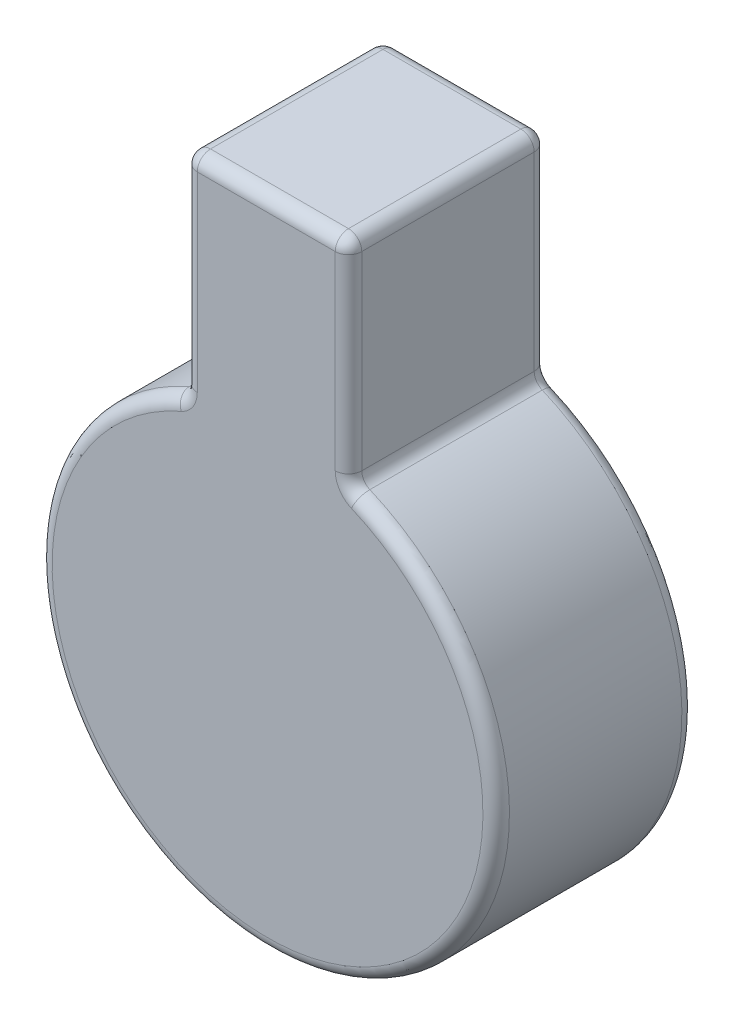
ISO-10303-21;
HEADER;
FILE_DESCRIPTION(('STEP AP214'),'2;1');
FILE_NAME('part.step','',(''),(''),'','','');
FILE_SCHEMA(('AUTOMOTIVE_DESIGN { 1 0 10303 214 1 1 1 1 }'));
ENDSEC;
DATA;
#1=APPLICATION_CONTEXT('core data for automotive mechanical design processes');
#2=APPLICATION_PROTOCOL_DEFINITION('international standard','automotive_design',2000,#1);
#3=PRODUCT_CONTEXT('',#1,'mechanical');
#4=PRODUCT('Part','Part','',(#3));
#5=PRODUCT_RELATED_PRODUCT_CATEGORY('part','',(#4));
#6=PRODUCT_DEFINITION_FORMATION('','',#4);
#7=PRODUCT_DEFINITION_CONTEXT('part definition',#1,'design');
#8=PRODUCT_DEFINITION('design','',#6,#7);
#9=PRODUCT_DEFINITION_SHAPE('','',#8);
#10=(LENGTH_UNIT() NAMED_UNIT(*) SI_UNIT(.MILLI.,.METRE.));
#11=(NAMED_UNIT(*) PLANE_ANGLE_UNIT() SI_UNIT($,.RADIAN.));
#12=(NAMED_UNIT(*) SI_UNIT($,.STERADIAN.) SOLID_ANGLE_UNIT());
#13=UNCERTAINTY_MEASURE_WITH_UNIT(LENGTH_MEASURE(1.E-05),#10,'distance_accuracy_value','');
#14=(GEOMETRIC_REPRESENTATION_CONTEXT(3) GLOBAL_UNCERTAINTY_ASSIGNED_CONTEXT((#13)) GLOBAL_UNIT_ASSIGNED_CONTEXT((#10,
#11,#12)) REPRESENTATION_CONTEXT('',''));
#15=CARTESIAN_POINT('',(0.,0.,0.));
#16=DIRECTION('',(0.,0.,1.));
#17=DIRECTION('',(1.,0.,0.));
#18=AXIS2_PLACEMENT_3D('',#15,#16,#17);
#19=CARTESIAN_POINT('',(0.,0.,38.1));
#20=DIRECTION('',(0.,0.,-1.));
#21=DIRECTION('',(-1.,0.,0.));
#22=AXIS2_PLACEMENT_3D('',#19,#20,#21);
#23=CYLINDRICAL_SURFACE('',#22,43.792404988183);
#24=CARTESIAN_POINT('',(0.,0.,2.54));
#25=DIRECTION('',(0.,0.,1.));
#26=DIRECTION('',(1.,0.,0.));
#27=AXIS2_PLACEMENT_3D('',#24,#25,#26);
#28=CIRCLE('',#27,43.792404988183);
#29=CARTESIAN_POINT('',(-17.5225403342247,40.1339670962702,2.54));
#30=VERTEX_POINT('',#29);
#31=CARTESIAN_POINT('',(17.0563701275492,40.3342902840881,2.54));
#32=VERTEX_POINT('',#31);
#33=EDGE_CURVE('E562',#30,#32,#28,.T.);
#34=ORIENTED_EDGE('',*,*,#33,.T.);
#35=DIRECTION('',(0.,0.,-1.));
#36=VECTOR('',#35,1.);
#37=CARTESIAN_POINT('',(17.0563701275492,40.3342902840881,38.1));
#38=LINE('',#37,#36);
#39=CARTESIAN_POINT('',(17.0563701275492,40.3342902840881,35.56));
#40=VERTEX_POINT('',#39);
#41=EDGE_CURVE('E190',#32,#40,#38,.F.);
#42=ORIENTED_EDGE('',*,*,#41,.T.);
#43=CARTESIAN_POINT('',(0.,0.,35.56));
#44=DIRECTION('',(0.,0.,1.));
#45=DIRECTION('',(1.,0.,0.));
#46=AXIS2_PLACEMENT_3D('',#43,#44,#45);
#47=CIRCLE('',#46,43.792404988183);
#48=CARTESIAN_POINT('',(-17.5225403342247,40.1339670962702,35.56));
#49=VERTEX_POINT('',#48);
#50=EDGE_CURVE('E156',#40,#49,#47,.F.);
#51=ORIENTED_EDGE('',*,*,#50,.T.);
#52=DIRECTION('',(0.,0.,-1.));
#53=VECTOR('',#52,1.);
#54=CARTESIAN_POINT('',(-17.5225403342247,40.1339670962702,38.1));
#55=LINE('',#54,#53);
#56=EDGE_CURVE('E188',#49,#30,#55,.T.);
#57=ORIENTED_EDGE('',*,*,#56,.T.);
#58=EDGE_LOOP('',(#34,#42,#51,#57));
#59=FACE_BOUND('',#58,.T.);
#60=ADVANCED_FACE('F34',(#59),#23,.T.);
#61=CARTESIAN_POINT('',(0.,0.,38.1));
#62=DIRECTION('',(0.,0.,1.));
#63=DIRECTION('',(1.,0.,0.));
#64=AXIS2_PLACEMENT_3D('',#61,#62,#63);
#65=PLANE('',#64);
#66=CARTESIAN_POINT('',(0.,0.,38.1));
#67=DIRECTION('',(0.,0.,1.));
#68=DIRECTION('',(1.,0.,0.));
#69=AXIS2_PLACEMENT_3D('',#66,#67,#68);
#70=CIRCLE('',#69,41.252404988183);
#71=CARTESIAN_POINT('',(-16.5062167854052,37.8061598782827,38.1));
#72=VERTEX_POINT('',#71);
#73=CARTESIAN_POINT('',(16.0670848819531,37.9948641358957,38.1));
#74=VERTEX_POINT('',#73);
#75=EDGE_CURVE('E51',#72,#74,#70,.T.);
#76=ORIENTED_EDGE('',*,*,#75,.T.);
#77=CARTESIAN_POINT('',(18.0456553731452,42.6737164322804,38.1));
#78=DIRECTION('',(0.,0.,1.));
#79=DIRECTION('',(1.,0.,0.));
#80=AXIS2_PLACEMENT_3D('',#77,#78,#79);
#81=CIRCLE('',#80,5.08);
#82=CARTESIAN_POINT('',(12.9656553731452,42.6737164322804,38.1));
#83=VERTEX_POINT('',#82);
#84=EDGE_CURVE('E43',#83,#74,#81,.T.);
#85=ORIENTED_EDGE('',*,*,#84,.F.);
#86=DIRECTION('',(0.,1.,0.));
#87=VECTOR('',#86,1.);
#88=CARTESIAN_POINT('',(12.9656553731452,0.,38.1));
#89=LINE('',#88,#87);
#90=CARTESIAN_POINT('',(12.9656553731452,79.0386409401533,38.1));
#91=VERTEX_POINT('',#90);
#92=EDGE_CURVE('E259',#83,#91,#89,.T.);
#93=ORIENTED_EDGE('',*,*,#92,.T.);
#94=DIRECTION('',(-1.,0.,0.));
#95=VECTOR('',#94,1.);
#96=CARTESIAN_POINT('',(0.,79.0386409401533,38.1));
#97=LINE('',#96,#95);
#98=CARTESIAN_POINT('',(-13.4588638830442,79.0386409401533,38.1));
#99=VERTEX_POINT('',#98);
#100=EDGE_CURVE('E175',#91,#99,#97,.T.);
#101=ORIENTED_EDGE('',*,*,#100,.T.);
#102=DIRECTION('',(0.,-1.,0.));
#103=VECTOR('',#102,1.);
#104=CARTESIAN_POINT('',(-13.4588638830442,0.,38.1));
#105=LINE('',#104,#103);
#106=CARTESIAN_POINT('',(-13.4588638830442,42.4617743142578,38.1));
#107=VERTEX_POINT('',#106);
#108=EDGE_CURVE('E177',#99,#107,#105,.T.);
#109=ORIENTED_EDGE('',*,*,#108,.T.);
#110=CARTESIAN_POINT('',(-18.5388638830442,42.4617743142578,38.1));
#111=DIRECTION('',(0.,0.,1.));
#112=DIRECTION('',(1.,0.,0.));
#113=AXIS2_PLACEMENT_3D('',#110,#111,#112);
#114=CIRCLE('',#113,5.08);
#115=EDGE_CURVE('E146',#107,#72,#114,.F.);
#116=ORIENTED_EDGE('',*,*,#115,.T.);
#117=EDGE_LOOP('',(#76,#85,#93,#101,#109,#116));
#118=FACE_BOUND('',#117,.T.);
#119=ADVANCED_FACE('F334',(#118),#65,.T.);
#120=CARTESIAN_POINT('',(0.,0.,0.));
#121=DIRECTION('',(0.,0.,1.));
#122=DIRECTION('',(1.,0.,0.));
#123=AXIS2_PLACEMENT_3D('',#120,#121,#122);
#124=PLANE('',#123);
#125=DIRECTION('',(0.,1.,0.));
#126=VECTOR('',#125,1.);
#127=CARTESIAN_POINT('',(12.9656553731452,38.2274190700643,0.));
#128=LINE('',#127,#126);
#129=CARTESIAN_POINT('',(12.9656553731452,79.0386409401533,0.));
#130=VERTEX_POINT('',#129);
#131=CARTESIAN_POINT('',(12.9656553731452,42.6737164322804,0.));
#132=VERTEX_POINT('',#131);
#133=EDGE_CURVE('E140',#130,#132,#128,.F.);
#134=ORIENTED_EDGE('',*,*,#133,.T.);
#135=CARTESIAN_POINT('',(18.0456553731452,42.6737164322804,0.));
#136=DIRECTION('',(0.,0.,1.));
#137=DIRECTION('',(1.,0.,0.));
#138=AXIS2_PLACEMENT_3D('',#135,#136,#137);
#139=CIRCLE('',#138,5.08);
#140=CARTESIAN_POINT('',(16.0670848819531,37.9948641358957,0.));
#141=VERTEX_POINT('',#140);
#142=EDGE_CURVE('E134',#132,#141,#139,.T.);
#143=ORIENTED_EDGE('',*,*,#142,.T.);
#144=CARTESIAN_POINT('',(0.,0.,0.));
#145=DIRECTION('',(0.,0.,1.));
#146=DIRECTION('',(1.,0.,0.));
#147=AXIS2_PLACEMENT_3D('',#144,#145,#146);
#148=CIRCLE('',#147,41.252404988183);
#149=CARTESIAN_POINT('',(-16.5062167854052,37.8061598782827,0.));
#150=VERTEX_POINT('',#149);
#151=EDGE_CURVE('E137',#141,#150,#148,.F.);
#152=ORIENTED_EDGE('',*,*,#151,.T.);
#153=CARTESIAN_POINT('',(-18.5388638830442,42.4617743142578,0.));
#154=DIRECTION('',(0.,0.,1.));
#155=DIRECTION('',(1.,0.,0.));
#156=AXIS2_PLACEMENT_3D('',#153,#154,#155);
#157=CIRCLE('',#156,5.08);
#158=CARTESIAN_POINT('',(-13.4588638830442,42.4617743142578,0.));
#159=VERTEX_POINT('',#158);
#160=EDGE_CURVE('E208',#150,#159,#157,.T.);
#161=ORIENTED_EDGE('',*,*,#160,.T.);
#162=DIRECTION('',(0.,-1.,0.));
#163=VECTOR('',#162,1.);
#164=CARTESIAN_POINT('',(-13.4588638830442,81.5786409401533,0.));
#165=LINE('',#164,#163);
#166=CARTESIAN_POINT('',(-13.4588638830442,79.0386409401533,0.));
#167=VERTEX_POINT('',#166);
#168=EDGE_CURVE('E206',#159,#167,#165,.F.);
#169=ORIENTED_EDGE('',*,*,#168,.T.);
#170=DIRECTION('',(-1.,0.,0.));
#171=VECTOR('',#170,1.);
#172=CARTESIAN_POINT('',(15.5056553731452,79.0386409401533,0.));
#173=LINE('',#172,#171);
#174=EDGE_CURVE('E204',#167,#130,#173,.F.);
#175=ORIENTED_EDGE('',*,*,#174,.T.);
#176=EDGE_LOOP('',(#134,#143,#152,#161,#169,#175));
#177=FACE_BOUND('',#176,.T.);
#178=ADVANCED_FACE('F136',(#177),#124,.F.);
#179=CARTESIAN_POINT('',(0.,0.,35.56));
#180=DIRECTION('',(0.,0.,1.));
#181=DIRECTION('',(1.,0.,0.));
#182=AXIS2_PLACEMENT_3D('',#179,#180,#181);
#183=TOROIDAL_SURFACE('',#182,41.252404988183,2.54);
#184=CARTESIAN_POINT('',(-16.5062167854052,37.8061598782827,35.56));
#185=DIRECTION('',(-0.916459534640768,-0.400127381424998,0.));
#186=DIRECTION('',(0.400127381424998,-0.916459534640768,0.));
#187=AXIS2_PLACEMENT_3D('',#184,#185,#186);
#188=CIRCLE('',#187,2.54);
#189=EDGE_CURVE('E172',#72,#49,#188,.T.);
#190=ORIENTED_EDGE('',*,*,#189,.T.);
#191=ORIENTED_EDGE('',*,*,#50,.F.);
#192=CARTESIAN_POINT('',(16.0670848819531,37.9948641358957,35.56));
#193=DIRECTION('',(-0.921033916611156,0.389482380155912,0.));
#194=DIRECTION('',(-0.389482380155912,-0.921033916611156,0.));
#195=AXIS2_PLACEMENT_3D('',#192,#193,#194);
#196=CIRCLE('',#195,2.54);
#197=EDGE_CURVE('E264',#74,#40,#196,.T.);
#198=ORIENTED_EDGE('',*,*,#197,.F.);
#199=ORIENTED_EDGE('',*,*,#75,.F.);
#200=EDGE_LOOP('',(#190,#191,#198,#199));
#201=FACE_BOUND('',#200,.T.);
#202=ADVANCED_FACE('F345',(#201),#183,.T.);
#203=CARTESIAN_POINT('',(0.,0.,2.54));
#204=DIRECTION('',(0.,0.,1.));
#205=DIRECTION('',(1.,0.,0.));
#206=AXIS2_PLACEMENT_3D('',#203,#204,#205);
#207=TOROIDAL_SURFACE('',#206,41.252404988183,2.54);
#208=ORIENTED_EDGE('',*,*,#151,.F.);
#209=CARTESIAN_POINT('',(16.0670848819531,37.9948641358957,2.54));
#210=DIRECTION('',(0.921033916611156,-0.389482380155912,0.));
#211=DIRECTION('',(0.389482380155912,0.921033916611156,0.));
#212=AXIS2_PLACEMENT_3D('',#209,#210,#211);
#213=CIRCLE('',#212,2.54);
#214=EDGE_CURVE('E152',#141,#32,#213,.T.);
#215=ORIENTED_EDGE('',*,*,#214,.T.);
#216=ORIENTED_EDGE('',*,*,#33,.F.);
#217=CARTESIAN_POINT('',(-16.5062167854052,37.8061598782827,2.54));
#218=DIRECTION('',(-0.916459534640768,-0.400127381424998,0.));
#219=DIRECTION('',(0.400127381424998,-0.916459534640768,0.));
#220=AXIS2_PLACEMENT_3D('',#217,#218,#219);
#221=CIRCLE('',#220,2.54);
#222=EDGE_CURVE('E155',#30,#150,#221,.T.);
#223=ORIENTED_EDGE('',*,*,#222,.T.);
#224=EDGE_LOOP('',(#208,#215,#216,#223));
#225=FACE_BOUND('',#224,.T.);
#226=ADVANCED_FACE('F150',(#225),#207,.T.);
#227=CARTESIAN_POINT('',(-15.9988638830442,38.0236409587626,0.));
#228=DIRECTION('',(-1.,0.,0.));
#229=DIRECTION('',(0.,0.,1.));
#230=AXIS2_PLACEMENT_3D('',#227,#228,#229);
#231=PLANE('',#230);
#232=DIRECTION('',(0.,0.,-1.));
#233=VECTOR('',#232,1.);
#234=CARTESIAN_POINT('',(-15.9988638830442,42.4617743142578,0.));
#235=LINE('',#234,#233);
#236=CARTESIAN_POINT('',(-15.9988638830442,42.4617743142578,2.54));
#237=VERTEX_POINT('',#236);
#238=CARTESIAN_POINT('',(-15.9988638830442,42.4617743142578,35.56));
#239=VERTEX_POINT('',#238);
#240=EDGE_CURVE('E183',#237,#239,#235,.F.);
#241=ORIENTED_EDGE('',*,*,#240,.T.);
#242=DIRECTION('',(0.,-1.,0.));
#243=VECTOR('',#242,1.);
#244=CARTESIAN_POINT('',(-15.9988638830442,38.0236409587626,35.56));
#245=LINE('',#244,#243);
#246=CARTESIAN_POINT('',(-15.9988638830442,79.0386409401533,35.56));
#247=VERTEX_POINT('',#246);
#248=EDGE_CURVE('E185',#239,#247,#245,.F.);
#249=ORIENTED_EDGE('',*,*,#248,.T.);
#250=DIRECTION('',(0.,0.,1.));
#251=VECTOR('',#250,1.);
#252=CARTESIAN_POINT('',(-15.9988638830442,79.0386409401533,0.));
#253=LINE('',#252,#251);
#254=CARTESIAN_POINT('',(-15.9988638830442,79.0386409401533,2.54));
#255=VERTEX_POINT('',#254);
#256=EDGE_CURVE('E181',#247,#255,#253,.F.);
#257=ORIENTED_EDGE('',*,*,#256,.T.);
#258=DIRECTION('',(0.,-1.,0.));
#259=VECTOR('',#258,1.);
#260=CARTESIAN_POINT('',(-15.9988638830442,38.0236409587626,2.54));
#261=LINE('',#260,#259);
#262=EDGE_CURVE('E179',#255,#237,#261,.T.);
#263=ORIENTED_EDGE('',*,*,#262,.T.);
#264=EDGE_LOOP('',(#241,#249,#257,#263));
#265=FACE_BOUND('',#264,.T.);
#266=ADVANCED_FACE('F312',(#265),#231,.T.);
#267=CARTESIAN_POINT('',(-15.9988638830442,81.5786409401533,0.));
#268=DIRECTION('',(0.,1.,0.));
#269=DIRECTION('',(0.,0.,1.));
#270=AXIS2_PLACEMENT_3D('',#267,#268,#269);
#271=PLANE('',#270);
#272=DIRECTION('',(0.,0.,1.));
#273=VECTOR('',#272,1.);
#274=CARTESIAN_POINT('',(-13.4588638830442,81.5786409401533,0.));
#275=LINE('',#274,#273);
#276=CARTESIAN_POINT('',(-13.4588638830442,81.5786409401533,2.54));
#277=VERTEX_POINT('',#276);
#278=CARTESIAN_POINT('',(-13.4588638830442,81.5786409401533,35.56));
#279=VERTEX_POINT('',#278);
#280=EDGE_CURVE('E197',#277,#279,#275,.T.);
#281=ORIENTED_EDGE('',*,*,#280,.T.);
#282=DIRECTION('',(-1.,0.,0.));
#283=VECTOR('',#282,1.);
#284=CARTESIAN_POINT('',(-15.9988638830442,81.5786409401533,35.56));
#285=LINE('',#284,#283);
#286=CARTESIAN_POINT('',(12.9656553731452,81.5786409401533,35.56));
#287=VERTEX_POINT('',#286);
#288=EDGE_CURVE('E200',#279,#287,#285,.F.);
#289=ORIENTED_EDGE('',*,*,#288,.T.);
#290=DIRECTION('',(0.,0.,1.));
#291=VECTOR('',#290,1.);
#292=CARTESIAN_POINT('',(12.9656553731452,81.5786409401533,0.));
#293=LINE('',#292,#291);
#294=CARTESIAN_POINT('',(12.9656553731452,81.5786409401533,2.54));
#295=VERTEX_POINT('',#294);
#296=EDGE_CURVE('E195',#287,#295,#293,.F.);
#297=ORIENTED_EDGE('',*,*,#296,.T.);
#298=DIRECTION('',(-1.,0.,0.));
#299=VECTOR('',#298,1.);
#300=CARTESIAN_POINT('',(-15.9988638830442,81.5786409401533,2.54));
#301=LINE('',#300,#299);
#302=EDGE_CURVE('E193',#295,#277,#301,.T.);
#303=ORIENTED_EDGE('',*,*,#302,.T.);
#304=EDGE_LOOP('',(#281,#289,#297,#303));
#305=FACE_BOUND('',#304,.T.);
#306=ADVANCED_FACE('F283',(#305),#271,.T.);
#307=CARTESIAN_POINT('',(15.5056553731452,38.0236409587626,0.));
#308=DIRECTION('',(1.,0.,0.));
#309=DIRECTION('',(0.,0.,-1.));
#310=AXIS2_PLACEMENT_3D('',#307,#308,#309);
#311=PLANE('',#310);
#312=DIRECTION('',(0.,0.,1.));
#313=VECTOR('',#312,1.);
#314=CARTESIAN_POINT('',(15.5056553731452,79.0386409401533,0.));
#315=LINE('',#314,#313);
#316=CARTESIAN_POINT('',(15.5056553731452,79.0386409401533,2.54));
#317=VERTEX_POINT('',#316);
#318=CARTESIAN_POINT('',(15.5056553731452,79.0386409401533,35.56));
#319=VERTEX_POINT('',#318);
#320=EDGE_CURVE('E164',#317,#319,#315,.T.);
#321=ORIENTED_EDGE('',*,*,#320,.T.);
#322=DIRECTION('',(0.,1.,0.));
#323=VECTOR('',#322,1.);
#324=CARTESIAN_POINT('',(15.5056553731452,38.0236409587626,35.56));
#325=LINE('',#324,#323);
#326=CARTESIAN_POINT('',(15.5056553731452,42.6737164322804,35.56));
#327=VERTEX_POINT('',#326);
#328=EDGE_CURVE('E11',#319,#327,#325,.F.);
#329=ORIENTED_EDGE('',*,*,#328,.T.);
#330=DIRECTION('',(0.,0.,-1.));
#331=VECTOR('',#330,1.);
#332=CARTESIAN_POINT('',(15.5056553731452,42.6737164322804,0.));
#333=LINE('',#332,#331);
#334=CARTESIAN_POINT('',(15.5056553731452,42.6737164322804,2.54));
#335=VERTEX_POINT('',#334);
#336=EDGE_CURVE('E170',#327,#335,#333,.T.);
#337=ORIENTED_EDGE('',*,*,#336,.T.);
#338=DIRECTION('',(0.,1.,0.));
#339=VECTOR('',#338,1.);
#340=CARTESIAN_POINT('',(15.5056553731452,81.5786409401533,2.54));
#341=LINE('',#340,#339);
#342=EDGE_CURVE('E162',#335,#317,#341,.T.);
#343=ORIENTED_EDGE('',*,*,#342,.T.);
#344=EDGE_LOOP('',(#321,#329,#337,#343));
#345=FACE_BOUND('',#344,.T.);
#346=ADVANCED_FACE('F495',(#345),#311,.T.);
#347=CARTESIAN_POINT('',(-18.5388638830442,42.4617743142578,35.56));
#348=DIRECTION('',(0.,0.,1.));
#349=DIRECTION('',(1.,0.,0.));
#350=AXIS2_PLACEMENT_3D('',#347,#348,#349);
#351=TOROIDAL_SURFACE('',#350,5.08,2.54);
#352=CARTESIAN_POINT('',(-13.4588638830442,42.4617743142578,35.56));
#353=DIRECTION('',(0.,-1.,0.));
#354=DIRECTION('',(0.,0.,-1.));
#355=AXIS2_PLACEMENT_3D('',#352,#353,#354);
#356=CIRCLE('',#355,2.54);
#357=EDGE_CURVE('E250',#239,#107,#356,.F.);
#358=ORIENTED_EDGE('',*,*,#357,.F.);
#359=CARTESIAN_POINT('',(-18.5388638830442,42.4617743142578,35.56));
#360=DIRECTION('',(0.,0.,1.));
#361=DIRECTION('',(1.,0.,0.));
#362=AXIS2_PLACEMENT_3D('',#359,#360,#361);
#363=CIRCLE('',#362,2.54);
#364=EDGE_CURVE('E253',#49,#239,#363,.T.);
#365=ORIENTED_EDGE('',*,*,#364,.F.);
#366=ORIENTED_EDGE('',*,*,#189,.F.);
#367=ORIENTED_EDGE('',*,*,#115,.F.);
#368=EDGE_LOOP('',(#358,#365,#366,#367));
#369=FACE_BOUND('',#368,.T.);
#370=ADVANCED_FACE('F487',(#369),#351,.T.);
#371=CARTESIAN_POINT('',(-18.5388638830442,42.4617743142578,38.1));
#372=DIRECTION('',(0.,0.,-1.));
#373=DIRECTION('',(-1.,0.,0.));
#374=AXIS2_PLACEMENT_3D('',#371,#372,#373);
#375=CYLINDRICAL_SURFACE('',#374,2.54);
#376=ORIENTED_EDGE('',*,*,#364,.T.);
#377=ORIENTED_EDGE('',*,*,#240,.F.);
#378=CARTESIAN_POINT('',(-18.5388638830442,42.4617743142578,2.54000000000001));
#379=DIRECTION('',(0.,0.,1.));
#380=DIRECTION('',(1.,0.,0.));
#381=AXIS2_PLACEMENT_3D('',#378,#379,#380);
#382=CIRCLE('',#381,2.54);
#383=EDGE_CURVE('E247',#30,#237,#382,.T.);
#384=ORIENTED_EDGE('',*,*,#383,.F.);
#385=ORIENTED_EDGE('',*,*,#56,.F.);
#386=EDGE_LOOP('',(#376,#377,#384,#385));
#387=FACE_BOUND('',#386,.T.);
#388=ADVANCED_FACE('F315',(#387),#375,.F.);
#389=CARTESIAN_POINT('',(-13.4588638830442,0.,35.56));
#390=DIRECTION('',(0.,-1.,0.));
#391=DIRECTION('',(0.,0.,-1.));
#392=AXIS2_PLACEMENT_3D('',#389,#390,#391);
#393=CYLINDRICAL_SURFACE('',#392,2.54);
#394=ORIENTED_EDGE('',*,*,#357,.T.);
#395=ORIENTED_EDGE('',*,*,#108,.F.);
#396=CARTESIAN_POINT('',(-13.4588638830442,79.0386409401533,35.56));
#397=DIRECTION('',(0.,1.,0.));
#398=DIRECTION('',(0.,0.,1.));
#399=AXIS2_PLACEMENT_3D('',#396,#397,#398);
#400=CIRCLE('',#399,2.54);
#401=EDGE_CURVE('E244',#247,#99,#400,.T.);
#402=ORIENTED_EDGE('',*,*,#401,.F.);
#403=ORIENTED_EDGE('',*,*,#248,.F.);
#404=EDGE_LOOP('',(#394,#395,#402,#403));
#405=FACE_BOUND('',#404,.T.);
#406=ADVANCED_FACE('F323',(#405),#393,.T.);
#407=CARTESIAN_POINT('',(-18.5388638830442,42.4617743142578,2.54));
#408=DIRECTION('',(0.,0.,1.));
#409=DIRECTION('',(1.,0.,0.));
#410=AXIS2_PLACEMENT_3D('',#407,#408,#409);
#411=TOROIDAL_SURFACE('',#410,5.08,2.54);
#412=ORIENTED_EDGE('',*,*,#222,.F.);
#413=ORIENTED_EDGE('',*,*,#383,.T.);
#414=CARTESIAN_POINT('',(-13.4588638830442,42.4617743142578,2.54));
#415=DIRECTION('',(0.,-1.,0.));
#416=DIRECTION('',(0.,0.,-1.));
#417=AXIS2_PLACEMENT_3D('',#414,#415,#416);
#418=CIRCLE('',#417,2.54);
#419=EDGE_CURVE('E238',#159,#237,#418,.F.);
#420=ORIENTED_EDGE('',*,*,#419,.F.);
#421=ORIENTED_EDGE('',*,*,#160,.F.);
#422=EDGE_LOOP('',(#412,#413,#420,#421));
#423=FACE_BOUND('',#422,.T.);
#424=ADVANCED_FACE('F320',(#423),#411,.T.);
#425=CARTESIAN_POINT('',(-13.4588638830442,79.0386409401533,35.56));
#426=DIRECTION('',(0.,0.,1.));
#427=DIRECTION('',(1.,0.,0.));
#428=AXIS2_PLACEMENT_3D('',#425,#426,#427);
#429=SPHERICAL_SURFACE('',#428,2.54);
#430=CARTESIAN_POINT('',(-13.4588638830442,79.0386409401533,35.56));
#431=DIRECTION('',(-1.,0.,0.));
#432=DIRECTION('',(0.,0.,1.));
#433=AXIS2_PLACEMENT_3D('',#430,#431,#432);
#434=CIRCLE('',#433,2.54);
#435=EDGE_CURVE('E235',#279,#99,#434,.F.);
#436=ORIENTED_EDGE('',*,*,#435,.F.);
#437=CARTESIAN_POINT('',(-13.4588638830442,79.0386409401533,35.56));
#438=DIRECTION('',(0.,0.,1.));
#439=DIRECTION('',(1.,0.,0.));
#440=AXIS2_PLACEMENT_3D('',#437,#438,#439);
#441=CIRCLE('',#440,2.54);
#442=EDGE_CURVE('E241',#247,#279,#441,.F.);
#443=ORIENTED_EDGE('',*,*,#442,.F.);
#444=ORIENTED_EDGE('',*,*,#401,.T.);
#445=EDGE_LOOP('',(#436,#443,#444));
#446=FACE_BOUND('',#445,.T.);
#447=ADVANCED_FACE('F322',(#446),#429,.T.);
#448=CARTESIAN_POINT('',(-13.4588638830442,79.0386409401533,0.));
#449=DIRECTION('',(0.,0.,1.));
#450=DIRECTION('',(1.,0.,0.));
#451=AXIS2_PLACEMENT_3D('',#448,#449,#450);
#452=CYLINDRICAL_SURFACE('',#451,2.54);
#453=ORIENTED_EDGE('',*,*,#442,.T.);
#454=ORIENTED_EDGE('',*,*,#280,.F.);
#455=CARTESIAN_POINT('',(-13.4588638830442,79.0386409401533,2.54));
#456=DIRECTION('',(0.,0.,-1.));
#457=DIRECTION('',(-1.,0.,0.));
#458=AXIS2_PLACEMENT_3D('',#455,#456,#457);
#459=CIRCLE('',#458,2.54);
#460=EDGE_CURVE('E232',#255,#277,#459,.T.);
#461=ORIENTED_EDGE('',*,*,#460,.F.);
#462=ORIENTED_EDGE('',*,*,#256,.F.);
#463=EDGE_LOOP('',(#453,#454,#461,#462));
#464=FACE_BOUND('',#463,.T.);
#465=ADVANCED_FACE('F300',(#464),#452,.T.);
#466=CARTESIAN_POINT('',(-13.4588638830442,38.0236409587626,2.54));
#467=DIRECTION('',(0.,1.,0.));
#468=DIRECTION('',(0.,0.,1.));
#469=AXIS2_PLACEMENT_3D('',#466,#467,#468);
#470=CYLINDRICAL_SURFACE('',#469,2.54);
#471=ORIENTED_EDGE('',*,*,#419,.T.);
#472=ORIENTED_EDGE('',*,*,#262,.F.);
#473=CARTESIAN_POINT('',(-13.4588638830442,79.0386409401533,2.54));
#474=DIRECTION('',(0.,1.,0.));
#475=DIRECTION('',(0.,0.,1.));
#476=AXIS2_PLACEMENT_3D('',#473,#474,#475);
#477=CIRCLE('',#476,2.54);
#478=EDGE_CURVE('E229',#167,#255,#477,.T.);
#479=ORIENTED_EDGE('',*,*,#478,.F.);
#480=ORIENTED_EDGE('',*,*,#168,.F.);
#481=EDGE_LOOP('',(#471,#472,#479,#480));
#482=FACE_BOUND('',#481,.T.);
#483=ADVANCED_FACE('F308',(#482),#470,.T.);
#484=CARTESIAN_POINT('',(0.,79.0386409401533,35.56));
#485=DIRECTION('',(-1.,0.,0.));
#486=DIRECTION('',(0.,0.,1.));
#487=AXIS2_PLACEMENT_3D('',#484,#485,#486);
#488=CYLINDRICAL_SURFACE('',#487,2.54);
#489=ORIENTED_EDGE('',*,*,#100,.F.);
#490=CARTESIAN_POINT('',(12.9656553731452,79.0386409401533,35.56));
#491=DIRECTION('',(-1.,0.,0.));
#492=DIRECTION('',(0.,0.,1.));
#493=AXIS2_PLACEMENT_3D('',#490,#491,#492);
#494=CIRCLE('',#493,2.54);
#495=EDGE_CURVE('E257',#91,#287,#494,.T.);
#496=ORIENTED_EDGE('',*,*,#495,.T.);
#497=ORIENTED_EDGE('',*,*,#288,.F.);
#498=ORIENTED_EDGE('',*,*,#435,.T.);
#499=EDGE_LOOP('',(#489,#496,#497,#498));
#500=FACE_BOUND('',#499,.T.);
#501=ADVANCED_FACE('F279',(#500),#488,.T.);
#502=CARTESIAN_POINT('',(-13.4588638830442,79.0386409401533,2.54));
#503=DIRECTION('',(0.,0.,1.));
#504=DIRECTION('',(1.,0.,0.));
#505=AXIS2_PLACEMENT_3D('',#502,#503,#504);
#506=SPHERICAL_SURFACE('',#505,2.54);
#507=ORIENTED_EDGE('',*,*,#478,.T.);
#508=ORIENTED_EDGE('',*,*,#460,.T.);
#509=CARTESIAN_POINT('',(-13.4588638830442,79.0386409401533,2.54));
#510=DIRECTION('',(-1.,0.,0.));
#511=DIRECTION('',(0.,0.,1.));
#512=AXIS2_PLACEMENT_3D('',#509,#510,#511);
#513=CIRCLE('',#512,2.54);
#514=EDGE_CURVE('E226',#167,#277,#513,.F.);
#515=ORIENTED_EDGE('',*,*,#514,.F.);
#516=EDGE_LOOP('',(#507,#508,#515));
#517=FACE_BOUND('',#516,.T.);
#518=ADVANCED_FACE('F303',(#517),#506,.T.);
#519=CARTESIAN_POINT('',(12.9656553731452,79.0386409401533,0.));
#520=DIRECTION('',(0.,0.,1.));
#521=DIRECTION('',(1.,0.,0.));
#522=AXIS2_PLACEMENT_3D('',#519,#520,#521);
#523=CYLINDRICAL_SURFACE('',#522,2.54);
#524=ORIENTED_EDGE('',*,*,#296,.F.);
#525=CARTESIAN_POINT('',(12.9656553731452,79.0386409401533,35.56));
#526=DIRECTION('',(0.,0.,1.));
#527=DIRECTION('',(1.,0.,0.));
#528=AXIS2_PLACEMENT_3D('',#525,#526,#527);
#529=CIRCLE('',#528,2.54);
#530=EDGE_CURVE('E145',#287,#319,#529,.F.);
#531=ORIENTED_EDGE('',*,*,#530,.T.);
#532=ORIENTED_EDGE('',*,*,#320,.F.);
#533=CARTESIAN_POINT('',(12.9656553731452,79.0386409401533,2.54));
#534=DIRECTION('',(0.,0.,-1.));
#535=DIRECTION('',(-1.,0.,0.));
#536=AXIS2_PLACEMENT_3D('',#533,#534,#535);
#537=CIRCLE('',#536,2.54);
#538=EDGE_CURVE('E223',#295,#317,#537,.T.);
#539=ORIENTED_EDGE('',*,*,#538,.F.);
#540=EDGE_LOOP('',(#524,#531,#532,#539));
#541=FACE_BOUND('',#540,.T.);
#542=ADVANCED_FACE('F288',(#541),#523,.T.);
#543=CARTESIAN_POINT('',(-15.9988638830442,79.0386409401533,2.54));
#544=DIRECTION('',(1.,0.,0.));
#545=DIRECTION('',(0.,0.,-1.));
#546=AXIS2_PLACEMENT_3D('',#543,#544,#545);
#547=CYLINDRICAL_SURFACE('',#546,2.54);
#548=ORIENTED_EDGE('',*,*,#514,.T.);
#549=ORIENTED_EDGE('',*,*,#302,.F.);
#550=CARTESIAN_POINT('',(12.9656553731452,79.0386409401533,2.54));
#551=DIRECTION('',(1.,0.,0.));
#552=DIRECTION('',(0.,0.,-1.));
#553=AXIS2_PLACEMENT_3D('',#550,#551,#552);
#554=CIRCLE('',#553,2.54);
#555=EDGE_CURVE('E220',#130,#295,#554,.T.);
#556=ORIENTED_EDGE('',*,*,#555,.F.);
#557=ORIENTED_EDGE('',*,*,#174,.F.);
#558=EDGE_LOOP('',(#548,#549,#556,#557));
#559=FACE_BOUND('',#558,.T.);
#560=ADVANCED_FACE('F296',(#559),#547,.T.);
#561=CARTESIAN_POINT('',(12.9656553731452,79.0386409401533,2.54));
#562=DIRECTION('',(0.,0.,1.));
#563=DIRECTION('',(1.,0.,0.));
#564=AXIS2_PLACEMENT_3D('',#561,#562,#563);
#565=SPHERICAL_SURFACE('',#564,2.54);
#566=ORIENTED_EDGE('',*,*,#555,.T.);
#567=ORIENTED_EDGE('',*,*,#538,.T.);
#568=CARTESIAN_POINT('',(12.9656553731452,79.0386409401533,2.54));
#569=DIRECTION('',(0.,1.,0.));
#570=DIRECTION('',(0.,0.,1.));
#571=AXIS2_PLACEMENT_3D('',#568,#569,#570);
#572=CIRCLE('',#571,2.54);
#573=EDGE_CURVE('E214',#130,#317,#572,.F.);
#574=ORIENTED_EDGE('',*,*,#573,.F.);
#575=EDGE_LOOP('',(#566,#567,#574));
#576=FACE_BOUND('',#575,.T.);
#577=ADVANCED_FACE('F293',(#576),#565,.T.);
#578=CARTESIAN_POINT('',(18.0456553731452,42.6737164322804,38.1));
#579=DIRECTION('',(0.,0.,-1.));
#580=DIRECTION('',(-1.,0.,0.));
#581=AXIS2_PLACEMENT_3D('',#578,#579,#580);
#582=CYLINDRICAL_SURFACE('',#581,2.54);
#583=CARTESIAN_POINT('',(18.0456553731452,42.6737164322804,35.56));
#584=DIRECTION('',(0.,0.,1.));
#585=DIRECTION('',(1.,0.,0.));
#586=AXIS2_PLACEMENT_3D('',#583,#584,#585);
#587=CIRCLE('',#586,2.54);
#588=EDGE_CURVE('E217',#327,#40,#587,.T.);
#589=ORIENTED_EDGE('',*,*,#588,.T.);
#590=ORIENTED_EDGE('',*,*,#41,.F.);
#591=CARTESIAN_POINT('',(18.0456553731452,42.6737164322804,2.54000000000001));
#592=DIRECTION('',(0.,0.,1.));
#593=DIRECTION('',(1.,0.,0.));
#594=AXIS2_PLACEMENT_3D('',#591,#592,#593);
#595=CIRCLE('',#594,2.54);
#596=EDGE_CURVE('E160',#335,#32,#595,.T.);
#597=ORIENTED_EDGE('',*,*,#596,.F.);
#598=ORIENTED_EDGE('',*,*,#336,.F.);
#599=EDGE_LOOP('',(#589,#590,#597,#598));
#600=FACE_BOUND('',#599,.T.);
#601=ADVANCED_FACE('F356',(#600),#582,.F.);
#602=CARTESIAN_POINT('',(12.9656553731452,38.0236409587626,2.54));
#603=DIRECTION('',(0.,-1.,0.));
#604=DIRECTION('',(0.,0.,-1.));
#605=AXIS2_PLACEMENT_3D('',#602,#603,#604);
#606=CYLINDRICAL_SURFACE('',#605,2.54);
#607=ORIENTED_EDGE('',*,*,#573,.T.);
#608=ORIENTED_EDGE('',*,*,#342,.F.);
#609=CARTESIAN_POINT('',(12.9656553731452,42.6737164322804,2.54));
#610=DIRECTION('',(0.,-1.,0.));
#611=DIRECTION('',(0.,0.,-1.));
#612=AXIS2_PLACEMENT_3D('',#609,#610,#611);
#613=CIRCLE('',#612,2.54);
#614=EDGE_CURVE('E211',#132,#335,#613,.T.);
#615=ORIENTED_EDGE('',*,*,#614,.F.);
#616=ORIENTED_EDGE('',*,*,#133,.F.);
#617=EDGE_LOOP('',(#607,#608,#615,#616));
#618=FACE_BOUND('',#617,.T.);
#619=ADVANCED_FACE('F353',(#618),#606,.T.);
#620=CARTESIAN_POINT('',(18.0456553731452,42.6737164322804,2.54));
#621=DIRECTION('',(0.,0.,1.));
#622=DIRECTION('',(1.,0.,0.));
#623=AXIS2_PLACEMENT_3D('',#620,#621,#622);
#624=TOROIDAL_SURFACE('',#623,5.08,2.54);
#625=ORIENTED_EDGE('',*,*,#214,.F.);
#626=ORIENTED_EDGE('',*,*,#142,.F.);
#627=ORIENTED_EDGE('',*,*,#614,.T.);
#628=ORIENTED_EDGE('',*,*,#596,.T.);
#629=EDGE_LOOP('',(#625,#626,#627,#628));
#630=FACE_BOUND('',#629,.T.);
#631=ADVANCED_FACE('F158',(#630),#624,.T.);
#632=CARTESIAN_POINT('',(12.9656553731452,79.0386409401533,35.56));
#633=DIRECTION('',(0.,0.,1.));
#634=DIRECTION('',(1.,0.,0.));
#635=AXIS2_PLACEMENT_3D('',#632,#633,#634);
#636=SPHERICAL_SURFACE('',#635,2.54);
#637=ORIENTED_EDGE('',*,*,#530,.F.);
#638=ORIENTED_EDGE('',*,*,#495,.F.);
#639=CARTESIAN_POINT('',(12.9656553731452,79.0386409401533,35.56));
#640=DIRECTION('',(0.,-1.,0.));
#641=DIRECTION('',(0.,0.,-1.));
#642=AXIS2_PLACEMENT_3D('',#639,#640,#641);
#643=CIRCLE('',#642,2.54);
#644=EDGE_CURVE('E38',#319,#91,#643,.T.);
#645=ORIENTED_EDGE('',*,*,#644,.F.);
#646=EDGE_LOOP('',(#637,#638,#645));
#647=FACE_BOUND('',#646,.T.);
#648=ADVANCED_FACE('F36',(#647),#636,.T.);
#649=CARTESIAN_POINT('',(12.9656553731452,0.,35.56));
#650=DIRECTION('',(0.,1.,0.));
#651=DIRECTION('',(0.,0.,1.));
#652=AXIS2_PLACEMENT_3D('',#649,#650,#651);
#653=CYLINDRICAL_SURFACE('',#652,2.54);
#654=ORIENTED_EDGE('',*,*,#644,.T.);
#655=ORIENTED_EDGE('',*,*,#92,.F.);
#656=CARTESIAN_POINT('',(12.9656553731452,42.6737164322804,35.56));
#657=DIRECTION('',(0.,-1.,0.));
#658=DIRECTION('',(0.,0.,-1.));
#659=AXIS2_PLACEMENT_3D('',#656,#657,#658);
#660=CIRCLE('',#659,2.54);
#661=EDGE_CURVE('E262',#327,#83,#660,.T.);
#662=ORIENTED_EDGE('',*,*,#661,.F.);
#663=ORIENTED_EDGE('',*,*,#328,.F.);
#664=EDGE_LOOP('',(#654,#655,#662,#663));
#665=FACE_BOUND('',#664,.T.);
#666=ADVANCED_FACE('F272',(#665),#653,.T.);
#667=CARTESIAN_POINT('',(18.0456553731452,42.6737164322804,35.56));
#668=DIRECTION('',(0.,0.,1.));
#669=DIRECTION('',(1.,0.,0.));
#670=AXIS2_PLACEMENT_3D('',#667,#668,#669);
#671=TOROIDAL_SURFACE('',#670,5.08,2.54);
#672=ORIENTED_EDGE('',*,*,#588,.F.);
#673=ORIENTED_EDGE('',*,*,#661,.T.);
#674=ORIENTED_EDGE('',*,*,#84,.T.);
#675=ORIENTED_EDGE('',*,*,#197,.T.);
#676=EDGE_LOOP('',(#672,#673,#674,#675));
#677=FACE_BOUND('',#676,.T.);
#678=ADVANCED_FACE('F425',(#677),#671,.T.);
#679=CLOSED_SHELL('',(#60,#119,#178,#202,#226,#266,#306,#346,#370,#388,#406,#424,#447,#465,#483,
#501,#518,#542,#560,#577,#601,#619,#631,#648,#666,#678));
#680=MANIFOLD_SOLID_BREP('B2',#679);
#681=ADVANCED_BREP_SHAPE_REPRESENTATION('',(#18,#680),#14);
#682=SHAPE_DEFINITION_REPRESENTATION(#9,#681);
ENDSEC;
END-ISO-10303-21;
